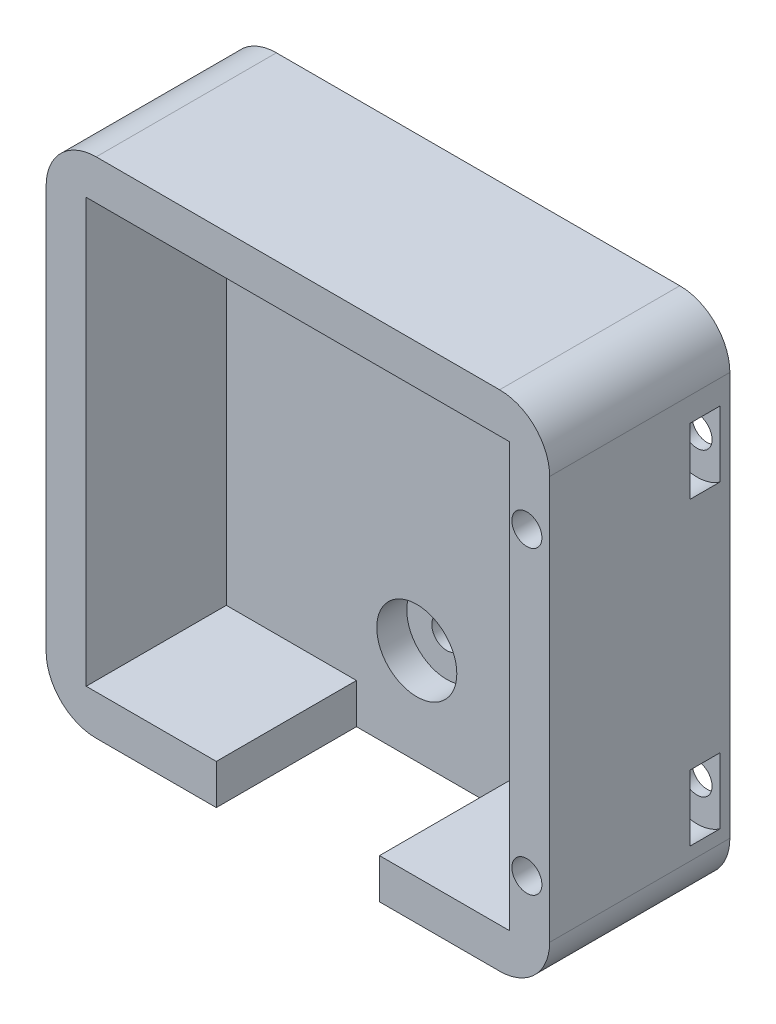
ISO-10303-21;
HEADER;
FILE_DESCRIPTION(('STEP AP214'),'2;1');
FILE_NAME('part.step','',(''),(''),'','','');
FILE_SCHEMA(('AUTOMOTIVE_DESIGN { 1 0 10303 214 1 1 1 1 }'));
ENDSEC;
DATA;
#1=APPLICATION_CONTEXT('core data for automotive mechanical design processes');
#2=APPLICATION_PROTOCOL_DEFINITION('international standard','automotive_design',2000,#1);
#3=PRODUCT_CONTEXT('',#1,'mechanical');
#4=PRODUCT('Part','Part','',(#3));
#5=PRODUCT_RELATED_PRODUCT_CATEGORY('part','',(#4));
#6=PRODUCT_DEFINITION_FORMATION('','',#4);
#7=PRODUCT_DEFINITION_CONTEXT('part definition',#1,'design');
#8=PRODUCT_DEFINITION('design','',#6,#7);
#9=PRODUCT_DEFINITION_SHAPE('','',#8);
#10=(LENGTH_UNIT() NAMED_UNIT(*) SI_UNIT(.MILLI.,.METRE.));
#11=(NAMED_UNIT(*) PLANE_ANGLE_UNIT() SI_UNIT($,.RADIAN.));
#12=(NAMED_UNIT(*) SI_UNIT($,.STERADIAN.) SOLID_ANGLE_UNIT());
#13=UNCERTAINTY_MEASURE_WITH_UNIT(LENGTH_MEASURE(1.E-05),#10,'distance_accuracy_value','');
#14=(GEOMETRIC_REPRESENTATION_CONTEXT(3) GLOBAL_UNCERTAINTY_ASSIGNED_CONTEXT((#13)) GLOBAL_UNIT_ASSIGNED_CONTEXT((#10,
#11,#12)) REPRESENTATION_CONTEXT('',''));
#15=CARTESIAN_POINT('',(0.,0.,0.));
#16=DIRECTION('',(0.,0.,1.));
#17=DIRECTION('',(1.,0.,0.));
#18=AXIS2_PLACEMENT_3D('',#15,#16,#17);
#19=CARTESIAN_POINT('',(50.3,0.,4.));
#20=DIRECTION('',(-1.,0.,0.));
#21=DIRECTION('',(0.,0.,1.));
#22=AXIS2_PLACEMENT_3D('',#19,#20,#21);
#23=PLANE('',#22);
#24=DIRECTION('',(0.,1.,0.));
#25=VECTOR('',#24,1.);
#26=CARTESIAN_POINT('',(50.3,0.,1.));
#27=LINE('',#26,#25);
#28=CARTESIAN_POINT('',(50.3,6.31049959872425,1.));
#29=VERTEX_POINT('',#28);
#30=CARTESIAN_POINT('',(50.3,12.8895004012762,1.));
#31=VERTEX_POINT('',#30);
#32=EDGE_CURVE('E288',#29,#31,#27,.T.);
#33=ORIENTED_EDGE('',*,*,#32,.F.);
#34=DIRECTION('',(0.,0.,1.));
#35=VECTOR('',#34,1.);
#36=CARTESIAN_POINT('',(50.3,6.31049959872425,1.));
#37=LINE('',#36,#35);
#38=CARTESIAN_POINT('',(50.3,6.31049959872425,4.));
#39=VERTEX_POINT('',#38);
#40=EDGE_CURVE('E339',#29,#39,#37,.T.);
#41=ORIENTED_EDGE('',*,*,#40,.T.);
#42=DIRECTION('',(0.,1.,0.));
#43=VECTOR('',#42,1.);
#44=CARTESIAN_POINT('',(50.3,0.,4.));
#45=LINE('',#44,#43);
#46=CARTESIAN_POINT('',(50.3,12.8895004012762,4.));
#47=VERTEX_POINT('',#46);
#48=EDGE_CURVE('E293',#39,#47,#45,.T.);
#49=ORIENTED_EDGE('',*,*,#48,.T.);
#50=DIRECTION('',(0.,0.,1.));
#51=VECTOR('',#50,1.);
#52=CARTESIAN_POINT('',(50.3,12.8895004012762,1.));
#53=LINE('',#52,#51);
#54=EDGE_CURVE('E336',#47,#31,#53,.F.);
#55=ORIENTED_EDGE('',*,*,#54,.T.);
#56=EDGE_LOOP('',(#33,#41,#49,#55));
#57=FACE_BOUND('',#56,.T.);
#58=DIRECTION('',(0.,1.,0.));
#59=VECTOR('',#58,1.);
#60=CARTESIAN_POINT('',(50.3,0.,0.));
#61=LINE('',#60,#59);
#62=CARTESIAN_POINT('',(50.3,5.,0.));
#63=VERTEX_POINT('',#62);
#64=CARTESIAN_POINT('',(50.3,45.3,0.));
#65=VERTEX_POINT('',#64);
#66=EDGE_CURVE('E379',#63,#65,#61,.T.);
#67=ORIENTED_EDGE('',*,*,#66,.T.);
#68=DIRECTION('',(0.,0.,-1.));
#69=VECTOR('',#68,1.);
#70=CARTESIAN_POINT('',(50.3,45.3,4.));
#71=LINE('',#70,#69);
#72=CARTESIAN_POINT('',(50.3,45.3,18.));
#73=VERTEX_POINT('',#72);
#74=EDGE_CURVE('E359',#65,#73,#71,.F.);
#75=ORIENTED_EDGE('',*,*,#74,.T.);
#76=DIRECTION('',(0.,1.,0.));
#77=VECTOR('',#76,1.);
#78=CARTESIAN_POINT('',(50.3,50.3,18.));
#79=LINE('',#78,#77);
#80=CARTESIAN_POINT('',(50.3,5.00000000000001,18.));
#81=VERTEX_POINT('',#80);
#82=EDGE_CURVE('E249',#81,#73,#79,.T.);
#83=ORIENTED_EDGE('',*,*,#82,.F.);
#84=DIRECTION('',(0.,0.,-1.));
#85=VECTOR('',#84,1.);
#86=CARTESIAN_POINT('',(50.3,5.,4.));
#87=LINE('',#86,#85);
#88=EDGE_CURVE('E356',#81,#63,#87,.T.);
#89=ORIENTED_EDGE('',*,*,#88,.T.);
#90=EDGE_LOOP('',(#67,#75,#83,#89));
#91=FACE_BOUND('',#90,.T.);
#92=DIRECTION('',(0.,1.,0.));
#93=VECTOR('',#92,1.);
#94=CARTESIAN_POINT('',(50.3,0.,1.));
#95=LINE('',#94,#93);
#96=CARTESIAN_POINT('',(50.3,36.3104995987245,1.));
#97=VERTEX_POINT('',#96);
#98=CARTESIAN_POINT('',(50.3,42.8895004012759,1.));
#99=VERTEX_POINT('',#98);
#100=EDGE_CURVE('E299',#97,#99,#95,.T.);
#101=ORIENTED_EDGE('',*,*,#100,.F.);
#102=DIRECTION('',(0.,0.,1.));
#103=VECTOR('',#102,1.);
#104=CARTESIAN_POINT('',(50.3,36.3104995987245,1.));
#105=LINE('',#104,#103);
#106=CARTESIAN_POINT('',(50.3,36.3104995987245,4.));
#107=VERTEX_POINT('',#106);
#108=EDGE_CURVE('E344',#97,#107,#105,.T.);
#109=ORIENTED_EDGE('',*,*,#108,.T.);
#110=DIRECTION('',(0.,1.,0.));
#111=VECTOR('',#110,1.);
#112=CARTESIAN_POINT('',(50.3,0.,4.));
#113=LINE('',#112,#111);
#114=CARTESIAN_POINT('',(50.3,42.8895004012759,4.));
#115=VERTEX_POINT('',#114);
#116=EDGE_CURVE('E195',#107,#115,#113,.T.);
#117=ORIENTED_EDGE('',*,*,#116,.T.);
#118=DIRECTION('',(0.,0.,1.));
#119=VECTOR('',#118,1.);
#120=CARTESIAN_POINT('',(50.3,42.8895004012759,1.));
#121=LINE('',#120,#119);
#122=EDGE_CURVE('E204',#115,#99,#121,.F.);
#123=ORIENTED_EDGE('',*,*,#122,.T.);
#124=EDGE_LOOP('',(#101,#109,#117,#123));
#125=FACE_BOUND('',#124,.T.);
#126=ADVANCED_FACE('F33',(#57,#91,#125),#23,.F.);
#127=CARTESIAN_POINT('',(48.0242172533378,9.60000000000021,18.));
#128=DIRECTION('',(0.,0.,-1.));
#129=DIRECTION('',(-1.,0.,0.));
#130=AXIS2_PLACEMENT_3D('',#127,#128,#129);
#131=CYLINDRICAL_SURFACE('',#130,1.5);
#132=CARTESIAN_POINT('',(48.0242172533378,9.60000000000021,0.));
#133=DIRECTION('',(0.,0.,-1.));
#134=DIRECTION('',(-1.,0.,0.));
#135=AXIS2_PLACEMENT_3D('',#132,#133,#134);
#136=CIRCLE('',#135,1.5);
#137=CARTESIAN_POINT('',(46.5242172533378,9.60000000000021,0.));
#138=VERTEX_POINT('',#137);
#139=EDGE_CURVE('E272',#138,#138,#136,.T.);
#140=ORIENTED_EDGE('',*,*,#139,.T.);
#141=EDGE_LOOP('',(#140));
#142=FACE_BOUND('',#141,.T.);
#143=CARTESIAN_POINT('',(48.0242172533378,9.60000000000021,1.));
#144=DIRECTION('',(0.,0.,1.));
#145=DIRECTION('',(1.,0.,0.));
#146=AXIS2_PLACEMENT_3D('',#143,#144,#145);
#147=CIRCLE('',#146,1.5);
#148=CARTESIAN_POINT('',(49.5242172533378,9.60000000000021,1.));
#149=VERTEX_POINT('',#148);
#150=EDGE_CURVE('E292',#149,#149,#147,.F.);
#151=ORIENTED_EDGE('',*,*,#150,.F.);
#152=EDGE_LOOP('',(#151));
#153=FACE_BOUND('',#152,.T.);
#154=ADVANCED_FACE('F422',(#142,#153),#131,.F.);
#155=CARTESIAN_POINT('',(48.0242172533375,39.6000000000002,18.));
#156=DIRECTION('',(0.,0.,-1.));
#157=DIRECTION('',(-1.,0.,0.));
#158=AXIS2_PLACEMENT_3D('',#155,#156,#157);
#159=CYLINDRICAL_SURFACE('',#158,1.5);
#160=CARTESIAN_POINT('',(48.0242172533375,39.6000000000002,0.));
#161=DIRECTION('',(0.,0.,-1.));
#162=DIRECTION('',(-1.,0.,0.));
#163=AXIS2_PLACEMENT_3D('',#160,#161,#162);
#164=CIRCLE('',#163,1.5);
#165=CARTESIAN_POINT('',(46.5242172533375,39.6000000000002,0.));
#166=VERTEX_POINT('',#165);
#167=EDGE_CURVE('E279',#166,#166,#164,.T.);
#168=ORIENTED_EDGE('',*,*,#167,.T.);
#169=EDGE_LOOP('',(#168));
#170=FACE_BOUND('',#169,.T.);
#171=CARTESIAN_POINT('',(48.0242172533375,39.6000000000002,1.));
#172=DIRECTION('',(0.,0.,1.));
#173=DIRECTION('',(1.,0.,0.));
#174=AXIS2_PLACEMENT_3D('',#171,#172,#173);
#175=CIRCLE('',#174,1.5);
#176=CARTESIAN_POINT('',(49.5242172533375,39.6000000000002,1.));
#177=VERTEX_POINT('',#176);
#178=EDGE_CURVE('E301',#177,#177,#175,.F.);
#179=ORIENTED_EDGE('',*,*,#178,.F.);
#180=EDGE_LOOP('',(#179));
#181=FACE_BOUND('',#180,.T.);
#182=ADVANCED_FACE('F430',(#170,#181),#159,.F.);
#183=CARTESIAN_POINT('',(23.0242172533378,9.60000000000021,18.));
#184=DIRECTION('',(0.,0.,-1.));
#185=DIRECTION('',(-1.,0.,0.));
#186=AXIS2_PLACEMENT_3D('',#183,#184,#185);
#187=CYLINDRICAL_SURFACE('',#186,1.5);
#188=CARTESIAN_POINT('',(23.0242172533378,9.60000000000021,0.));
#189=DIRECTION('',(0.,0.,-1.));
#190=DIRECTION('',(-1.,0.,0.));
#191=AXIS2_PLACEMENT_3D('',#188,#189,#190);
#192=CIRCLE('',#191,1.5);
#193=CARTESIAN_POINT('',(21.5242172533378,9.60000000000021,0.));
#194=VERTEX_POINT('',#193);
#195=EDGE_CURVE('E269',#194,#194,#192,.T.);
#196=ORIENTED_EDGE('',*,*,#195,.T.);
#197=EDGE_LOOP('',(#196));
#198=FACE_BOUND('',#197,.T.);
#199=CARTESIAN_POINT('',(23.0242172533378,9.60000000000021,1.));
#200=DIRECTION('',(0.,0.,1.));
#201=DIRECTION('',(1.,0.,0.));
#202=AXIS2_PLACEMENT_3D('',#199,#200,#201);
#203=CIRCLE('',#202,1.5);
#204=CARTESIAN_POINT('',(24.5242172533378,9.60000000000021,1.));
#205=VERTEX_POINT('',#204);
#206=EDGE_CURVE('E318',#205,#205,#203,.F.);
#207=ORIENTED_EDGE('',*,*,#206,.F.);
#208=EDGE_LOOP('',(#207));
#209=FACE_BOUND('',#208,.T.);
#210=ADVANCED_FACE('F462',(#198,#209),#187,.F.);
#211=CARTESIAN_POINT('',(23.0242172533375,39.6000000000002,18.));
#212=DIRECTION('',(0.,0.,-1.));
#213=DIRECTION('',(-1.,0.,0.));
#214=AXIS2_PLACEMENT_3D('',#211,#212,#213);
#215=CYLINDRICAL_SURFACE('',#214,1.5);
#216=CARTESIAN_POINT('',(23.0242172533375,39.6000000000002,0.));
#217=DIRECTION('',(0.,0.,-1.));
#218=DIRECTION('',(-1.,0.,0.));
#219=AXIS2_PLACEMENT_3D('',#216,#217,#218);
#220=CIRCLE('',#219,1.5);
#221=CARTESIAN_POINT('',(21.5242172533375,39.6000000000002,0.));
#222=VERTEX_POINT('',#221);
#223=EDGE_CURVE('E235',#222,#222,#220,.T.);
#224=ORIENTED_EDGE('',*,*,#223,.T.);
#225=EDGE_LOOP('',(#224));
#226=FACE_BOUND('',#225,.T.);
#227=CARTESIAN_POINT('',(23.0242172533375,39.6000000000002,1.));
#228=DIRECTION('',(0.,0.,1.));
#229=DIRECTION('',(1.,0.,0.));
#230=AXIS2_PLACEMENT_3D('',#227,#228,#229);
#231=CIRCLE('',#230,1.5);
#232=CARTESIAN_POINT('',(24.5242172533375,39.6000000000002,1.));
#233=VERTEX_POINT('',#232);
#234=EDGE_CURVE('E273',#233,#233,#231,.F.);
#235=ORIENTED_EDGE('',*,*,#234,.F.);
#236=EDGE_LOOP('',(#235));
#237=FACE_BOUND('',#236,.T.);
#238=ADVANCED_FACE('F467',(#226,#237),#215,.F.);
#239=CARTESIAN_POINT('',(0.,0.,4.));
#240=DIRECTION('',(0.,0.,-1.));
#241=DIRECTION('',(-1.,0.,0.));
#242=AXIS2_PLACEMENT_3D('',#239,#240,#241);
#243=PLANE('',#242);
#244=CARTESIAN_POINT('',(23.0242172533378,9.60000000000021,4.));
#245=DIRECTION('',(0.,0.,1.));
#246=DIRECTION('',(1.,0.,0.));
#247=AXIS2_PLACEMENT_3D('',#244,#245,#246);
#248=CIRCLE('',#247,4.00000000000001);
#249=CARTESIAN_POINT('',(27.0242172533378,9.60000000000021,4.));
#250=VERTEX_POINT('',#249);
#251=EDGE_CURVE('E313',#250,#250,#248,.T.);
#252=ORIENTED_EDGE('',*,*,#251,.F.);
#253=EDGE_LOOP('',(#252));
#254=FACE_BOUND('',#253,.T.);
#255=CARTESIAN_POINT('',(23.0242172533375,39.6000000000002,4.));
#256=DIRECTION('',(0.,0.,1.));
#257=DIRECTION('',(1.,0.,0.));
#258=AXIS2_PLACEMENT_3D('',#255,#256,#257);
#259=CIRCLE('',#258,4.);
#260=CARTESIAN_POINT('',(27.0242172533375,39.6000000000002,4.));
#261=VERTEX_POINT('',#260);
#262=EDGE_CURVE('E284',#261,#261,#259,.T.);
#263=ORIENTED_EDGE('',*,*,#262,.F.);
#264=EDGE_LOOP('',(#263));
#265=FACE_BOUND('',#264,.T.);
#266=DIRECTION('',(0.,-1.,0.));
#267=VECTOR('',#266,1.);
#268=CARTESIAN_POINT('',(46.3,46.3,4.));
#269=LINE('',#268,#267);
#270=CARTESIAN_POINT('',(46.3,35.9906960694212,4.));
#271=VERTEX_POINT('',#270);
#272=CARTESIAN_POINT('',(46.3,13.2093039305791,4.));
#273=VERTEX_POINT('',#272);
#274=EDGE_CURVE('E213',#271,#273,#269,.T.);
#275=ORIENTED_EDGE('',*,*,#274,.F.);
#276=CARTESIAN_POINT('',(48.0242172533375,39.6000000000002,4.));
#277=DIRECTION('',(0.,0.,1.));
#278=DIRECTION('',(1.,0.,0.));
#279=AXIS2_PLACEMENT_3D('',#276,#277,#278);
#280=CIRCLE('',#279,4.00000000000001);
#281=CARTESIAN_POINT('',(46.3,43.2093039305793,4.));
#282=VERTEX_POINT('',#281);
#283=EDGE_CURVE('E202',#282,#271,#280,.T.);
#284=ORIENTED_EDGE('',*,*,#283,.F.);
#285=CARTESIAN_POINT('',(46.3,46.3,4.));
#286=VERTEX_POINT('',#285);
#287=EDGE_CURVE('E210',#286,#282,#269,.T.);
#288=ORIENTED_EDGE('',*,*,#287,.F.);
#289=DIRECTION('',(1.,0.,0.));
#290=VECTOR('',#289,1.);
#291=CARTESIAN_POINT('',(4.,46.3,4.));
#292=LINE('',#291,#290);
#293=CARTESIAN_POINT('',(4.,46.3,4.));
#294=VERTEX_POINT('',#293);
#295=EDGE_CURVE('E226',#294,#286,#292,.T.);
#296=ORIENTED_EDGE('',*,*,#295,.F.);
#297=DIRECTION('',(0.,1.,0.));
#298=VECTOR('',#297,1.);
#299=CARTESIAN_POINT('',(4.,46.3,4.));
#300=LINE('',#299,#298);
#301=CARTESIAN_POINT('',(4.00000000000001,4.,4.));
#302=VERTEX_POINT('',#301);
#303=EDGE_CURVE('E231',#302,#294,#300,.T.);
#304=ORIENTED_EDGE('',*,*,#303,.F.);
#305=DIRECTION('',(-1.,0.,0.));
#306=VECTOR('',#305,1.);
#307=CARTESIAN_POINT('',(4.00000000000001,4.,4.));
#308=LINE('',#307,#306);
#309=CARTESIAN_POINT('',(17.,4.,4.));
#310=VERTEX_POINT('',#309);
#311=EDGE_CURVE('E265',#310,#302,#308,.T.);
#312=ORIENTED_EDGE('',*,*,#311,.F.);
#313=DIRECTION('',(0.,1.,0.));
#314=VECTOR('',#313,1.);
#315=CARTESIAN_POINT('',(17.,4.,4.));
#316=LINE('',#315,#314);
#317=CARTESIAN_POINT('',(17.,0.,4.));
#318=VERTEX_POINT('',#317);
#319=EDGE_CURVE('E571',#318,#310,#316,.T.);
#320=ORIENTED_EDGE('',*,*,#319,.F.);
#321=DIRECTION('',(1.,0.,0.));
#322=VECTOR('',#321,1.);
#323=CARTESIAN_POINT('',(0.,0.,4.));
#324=LINE('',#323,#322);
#325=CARTESIAN_POINT('',(33.3,0.,4.));
#326=VERTEX_POINT('',#325);
#327=EDGE_CURVE('E390',#318,#326,#324,.T.);
#328=ORIENTED_EDGE('',*,*,#327,.T.);
#329=DIRECTION('',(0.,-1.,0.));
#330=VECTOR('',#329,1.);
#331=CARTESIAN_POINT('',(33.3,4.00000000000001,4.));
#332=LINE('',#331,#330);
#333=CARTESIAN_POINT('',(33.3,4.00000000000001,4.));
#334=VERTEX_POINT('',#333);
#335=EDGE_CURVE('E223',#334,#326,#332,.T.);
#336=ORIENTED_EDGE('',*,*,#335,.F.);
#337=DIRECTION('',(-1.,0.,0.));
#338=VECTOR('',#337,1.);
#339=CARTESIAN_POINT('',(33.3,4.00000000000001,4.));
#340=LINE('',#339,#338);
#341=CARTESIAN_POINT('',(46.3,4.,4.));
#342=VERTEX_POINT('',#341);
#343=EDGE_CURVE('E219',#342,#334,#340,.T.);
#344=ORIENTED_EDGE('',*,*,#343,.F.);
#345=CARTESIAN_POINT('',(46.3,5.99069606942131,4.));
#346=VERTEX_POINT('',#345);
#347=EDGE_CURVE('E221',#346,#342,#269,.T.);
#348=ORIENTED_EDGE('',*,*,#347,.F.);
#349=CARTESIAN_POINT('',(48.0242172533378,9.60000000000021,4.));
#350=DIRECTION('',(0.,0.,1.));
#351=DIRECTION('',(1.,0.,0.));
#352=AXIS2_PLACEMENT_3D('',#349,#350,#351);
#353=CIRCLE('',#352,4.00000000000001);
#354=EDGE_CURVE('E307',#273,#346,#353,.T.);
#355=ORIENTED_EDGE('',*,*,#354,.F.);
#356=EDGE_LOOP('',(#275,#284,#288,#296,#304,#312,#320,#328,#336,#344,#348,#355));
#357=FACE_BOUND('',#356,.T.);
#358=ADVANCED_FACE('F209',(#254,#265,#357),#243,.F.);
#359=CARTESIAN_POINT('',(0.,0.,4.));
#360=DIRECTION('',(1.,0.,0.));
#361=DIRECTION('',(0.,0.,-1.));
#362=AXIS2_PLACEMENT_3D('',#359,#360,#361);
#363=PLANE('',#362);
#364=DIRECTION('',(0.,-1.,0.));
#365=VECTOR('',#364,1.);
#366=CARTESIAN_POINT('',(0.,0.,0.));
#367=LINE('',#366,#365);
#368=CARTESIAN_POINT('',(0.,45.3,0.));
#369=VERTEX_POINT('',#368);
#370=CARTESIAN_POINT('',(0.,5.,0.));
#371=VERTEX_POINT('',#370);
#372=EDGE_CURVE('E380',#369,#371,#367,.T.);
#373=ORIENTED_EDGE('',*,*,#372,.T.);
#374=DIRECTION('',(0.,0.,-1.));
#375=VECTOR('',#374,1.);
#376=CARTESIAN_POINT('',(0.,5.,4.));
#377=LINE('',#376,#375);
#378=CARTESIAN_POINT('',(0.,5.00000000000001,18.));
#379=VERTEX_POINT('',#378);
#380=EDGE_CURVE('E11',#371,#379,#377,.F.);
#381=ORIENTED_EDGE('',*,*,#380,.T.);
#382=DIRECTION('',(0.,-1.,0.));
#383=VECTOR('',#382,1.);
#384=CARTESIAN_POINT('',(0.,50.3,18.));
#385=LINE('',#384,#383);
#386=CARTESIAN_POINT('',(0.,45.3,18.));
#387=VERTEX_POINT('',#386);
#388=EDGE_CURVE('E245',#387,#379,#385,.T.);
#389=ORIENTED_EDGE('',*,*,#388,.F.);
#390=DIRECTION('',(0.,0.,-1.));
#391=VECTOR('',#390,1.);
#392=CARTESIAN_POINT('',(0.,45.3,4.));
#393=LINE('',#392,#391);
#394=EDGE_CURVE('E391',#387,#369,#393,.T.);
#395=ORIENTED_EDGE('',*,*,#394,.T.);
#396=EDGE_LOOP('',(#373,#381,#389,#395));
#397=FACE_BOUND('',#396,.T.);
#398=ADVANCED_FACE('F407',(#397),#363,.F.);
#399=CARTESIAN_POINT('',(0.,0.,4.));
#400=DIRECTION('',(0.,1.,0.));
#401=DIRECTION('',(0.,0.,1.));
#402=AXIS2_PLACEMENT_3D('',#399,#400,#401);
#403=PLANE('',#402);
#404=DIRECTION('',(1.,0.,0.));
#405=VECTOR('',#404,1.);
#406=CARTESIAN_POINT('',(0.,0.,18.));
#407=LINE('',#406,#405);
#408=CARTESIAN_POINT('',(5.,0.,18.));
#409=VERTEX_POINT('',#408);
#410=CARTESIAN_POINT('',(17.,0.,18.));
#411=VERTEX_POINT('',#410);
#412=EDGE_CURVE('E243',#409,#411,#407,.T.);
#413=ORIENTED_EDGE('',*,*,#412,.F.);
#414=DIRECTION('',(0.,0.,-1.));
#415=VECTOR('',#414,1.);
#416=CARTESIAN_POINT('',(5.,0.,4.));
#417=LINE('',#416,#415);
#418=CARTESIAN_POINT('',(5.,0.,0.));
#419=VERTEX_POINT('',#418);
#420=EDGE_CURVE('E41',#409,#419,#417,.T.);
#421=ORIENTED_EDGE('',*,*,#420,.T.);
#422=DIRECTION('',(1.,0.,0.));
#423=VECTOR('',#422,1.);
#424=CARTESIAN_POINT('',(0.,0.,0.));
#425=LINE('',#424,#423);
#426=CARTESIAN_POINT('',(45.3,0.,0.));
#427=VERTEX_POINT('',#426);
#428=EDGE_CURVE('E370',#419,#427,#425,.T.);
#429=ORIENTED_EDGE('',*,*,#428,.T.);
#430=DIRECTION('',(0.,0.,-1.));
#431=VECTOR('',#430,1.);
#432=CARTESIAN_POINT('',(45.3,0.,4.));
#433=LINE('',#432,#431);
#434=CARTESIAN_POINT('',(45.3,0.,18.));
#435=VERTEX_POINT('',#434);
#436=EDGE_CURVE('E48',#427,#435,#433,.F.);
#437=ORIENTED_EDGE('',*,*,#436,.T.);
#438=DIRECTION('',(1.,0.,0.));
#439=VECTOR('',#438,1.);
#440=CARTESIAN_POINT('',(33.3,0.,18.));
#441=LINE('',#440,#439);
#442=CARTESIAN_POINT('',(33.3,0.,18.));
#443=VERTEX_POINT('',#442);
#444=EDGE_CURVE('E252',#443,#435,#441,.T.);
#445=ORIENTED_EDGE('',*,*,#444,.F.);
#446=DIRECTION('',(0.,0.,-1.));
#447=VECTOR('',#446,1.);
#448=CARTESIAN_POINT('',(33.3,0.,18.));
#449=LINE('',#448,#447);
#450=EDGE_CURVE('E565',#443,#326,#449,.T.);
#451=ORIENTED_EDGE('',*,*,#450,.T.);
#452=ORIENTED_EDGE('',*,*,#327,.F.);
#453=DIRECTION('',(0.,0.,-1.));
#454=VECTOR('',#453,1.);
#455=CARTESIAN_POINT('',(17.,0.,18.));
#456=LINE('',#455,#454);
#457=EDGE_CURVE('E579',#411,#318,#456,.T.);
#458=ORIENTED_EDGE('',*,*,#457,.F.);
#459=EDGE_LOOP('',(#413,#421,#429,#437,#445,#451,#452,#458));
#460=FACE_BOUND('',#459,.T.);
#461=ADVANCED_FACE('F369',(#460),#403,.F.);
#462=CARTESIAN_POINT('',(0.,50.3,4.));
#463=DIRECTION('',(0.,-1.,0.));
#464=DIRECTION('',(0.,0.,-1.));
#465=AXIS2_PLACEMENT_3D('',#462,#463,#464);
#466=PLANE('',#465);
#467=DIRECTION('',(-1.,0.,0.));
#468=VECTOR('',#467,1.);
#469=CARTESIAN_POINT('',(0.,50.3,18.));
#470=LINE('',#469,#468);
#471=CARTESIAN_POINT('',(45.3,50.3,18.));
#472=VERTEX_POINT('',#471);
#473=CARTESIAN_POINT('',(5.,50.3,18.));
#474=VERTEX_POINT('',#473);
#475=EDGE_CURVE('E247',#472,#474,#470,.T.);
#476=ORIENTED_EDGE('',*,*,#475,.F.);
#477=DIRECTION('',(0.,0.,-1.));
#478=VECTOR('',#477,1.);
#479=CARTESIAN_POINT('',(45.3,50.3,4.));
#480=LINE('',#479,#478);
#481=CARTESIAN_POINT('',(45.3,50.3,0.));
#482=VERTEX_POINT('',#481);
#483=EDGE_CURVE('E347',#472,#482,#480,.T.);
#484=ORIENTED_EDGE('',*,*,#483,.T.);
#485=DIRECTION('',(-1.,0.,0.));
#486=VECTOR('',#485,1.);
#487=CARTESIAN_POINT('',(0.,50.3,0.));
#488=LINE('',#487,#486);
#489=CARTESIAN_POINT('',(5.,50.3,0.));
#490=VERTEX_POINT('',#489);
#491=EDGE_CURVE('E383',#482,#490,#488,.T.);
#492=ORIENTED_EDGE('',*,*,#491,.T.);
#493=DIRECTION('',(0.,0.,-1.));
#494=VECTOR('',#493,1.);
#495=CARTESIAN_POINT('',(5.,50.3,4.));
#496=LINE('',#495,#494);
#497=EDGE_CURVE('E397',#490,#474,#496,.F.);
#498=ORIENTED_EDGE('',*,*,#497,.T.);
#499=EDGE_LOOP('',(#476,#484,#492,#498));
#500=FACE_BOUND('',#499,.T.);
#501=ADVANCED_FACE('F438',(#500),#466,.F.);
#502=CARTESIAN_POINT('',(0.,0.,0.));
#503=DIRECTION('',(0.,0.,-1.));
#504=DIRECTION('',(-1.,0.,0.));
#505=AXIS2_PLACEMENT_3D('',#502,#503,#504);
#506=PLANE('',#505);
#507=ORIENTED_EDGE('',*,*,#167,.F.);
#508=EDGE_LOOP('',(#507));
#509=FACE_BOUND('',#508,.T.);
#510=ORIENTED_EDGE('',*,*,#139,.F.);
#511=EDGE_LOOP('',(#510));
#512=FACE_BOUND('',#511,.T.);
#513=ORIENTED_EDGE('',*,*,#195,.F.);
#514=EDGE_LOOP('',(#513));
#515=FACE_BOUND('',#514,.T.);
#516=ORIENTED_EDGE('',*,*,#223,.F.);
#517=EDGE_LOOP('',(#516));
#518=FACE_BOUND('',#517,.T.);
#519=ORIENTED_EDGE('',*,*,#491,.F.);
#520=CARTESIAN_POINT('',(45.3,45.3,0.));
#521=DIRECTION('',(0.,0.,-1.));
#522=DIRECTION('',(-1.,0.,0.));
#523=AXIS2_PLACEMENT_3D('',#520,#521,#522);
#524=CIRCLE('',#523,5.);
#525=EDGE_CURVE('E354',#482,#65,#524,.T.);
#526=ORIENTED_EDGE('',*,*,#525,.T.);
#527=ORIENTED_EDGE('',*,*,#66,.F.);
#528=CARTESIAN_POINT('',(45.3,5.,0.));
#529=DIRECTION('',(0.,0.,-1.));
#530=DIRECTION('',(-1.,0.,0.));
#531=AXIS2_PLACEMENT_3D('',#528,#529,#530);
#532=CIRCLE('',#531,5.);
#533=EDGE_CURVE('E350',#63,#427,#532,.T.);
#534=ORIENTED_EDGE('',*,*,#533,.T.);
#535=ORIENTED_EDGE('',*,*,#428,.F.);
#536=CARTESIAN_POINT('',(5.,5.,0.));
#537=DIRECTION('',(0.,0.,-1.));
#538=DIRECTION('',(-1.,0.,0.));
#539=AXIS2_PLACEMENT_3D('',#536,#537,#538);
#540=CIRCLE('',#539,5.);
#541=EDGE_CURVE('E352',#419,#371,#540,.T.);
#542=ORIENTED_EDGE('',*,*,#541,.T.);
#543=ORIENTED_EDGE('',*,*,#372,.F.);
#544=CARTESIAN_POINT('',(5.,45.3,0.));
#545=DIRECTION('',(0.,0.,-1.));
#546=DIRECTION('',(-1.,0.,0.));
#547=AXIS2_PLACEMENT_3D('',#544,#545,#546);
#548=CIRCLE('',#547,5.);
#549=EDGE_CURVE('E394',#369,#490,#548,.T.);
#550=ORIENTED_EDGE('',*,*,#549,.T.);
#551=EDGE_LOOP('',(#519,#526,#527,#534,#535,#542,#543,#550));
#552=FACE_BOUND('',#551,.T.);
#553=ADVANCED_FACE('F375',(#509,#512,#515,#518,#552),#506,.T.);
#554=CARTESIAN_POINT('',(4.,46.3,18.));
#555=DIRECTION('',(-1.,0.,0.));
#556=DIRECTION('',(0.,-1.,0.));
#557=AXIS2_PLACEMENT_3D('',#554,#555,#556);
#558=PLANE('',#557);
#559=ORIENTED_EDGE('',*,*,#303,.T.);
#560=DIRECTION('',(0.,0.,-1.));
#561=VECTOR('',#560,1.);
#562=CARTESIAN_POINT('',(4.,46.3,18.));
#563=LINE('',#562,#561);
#564=CARTESIAN_POINT('',(4.,46.3,18.));
#565=VERTEX_POINT('',#564);
#566=EDGE_CURVE('E385',#565,#294,#563,.T.);
#567=ORIENTED_EDGE('',*,*,#566,.F.);
#568=DIRECTION('',(0.,1.,0.));
#569=VECTOR('',#568,1.);
#570=CARTESIAN_POINT('',(4.,46.3,18.));
#571=LINE('',#570,#569);
#572=CARTESIAN_POINT('',(4.00000000000001,4.,18.));
#573=VERTEX_POINT('',#572);
#574=EDGE_CURVE('E262',#573,#565,#571,.T.);
#575=ORIENTED_EDGE('',*,*,#574,.F.);
#576=DIRECTION('',(0.,0.,-1.));
#577=VECTOR('',#576,1.);
#578=CARTESIAN_POINT('',(4.00000000000001,4.,18.));
#579=LINE('',#578,#577);
#580=EDGE_CURVE('E240',#573,#302,#579,.T.);
#581=ORIENTED_EDGE('',*,*,#580,.T.);
#582=EDGE_LOOP('',(#559,#567,#575,#581));
#583=FACE_BOUND('',#582,.T.);
#584=ADVANCED_FACE('F523',(#583),#558,.F.);
#585=CARTESIAN_POINT('',(4.,46.3,18.));
#586=DIRECTION('',(0.,1.,0.));
#587=DIRECTION('',(0.,0.,1.));
#588=AXIS2_PLACEMENT_3D('',#585,#586,#587);
#589=PLANE('',#588);
#590=ORIENTED_EDGE('',*,*,#295,.T.);
#591=DIRECTION('',(0.,0.,-1.));
#592=VECTOR('',#591,1.);
#593=CARTESIAN_POINT('',(46.3,46.3,18.));
#594=LINE('',#593,#592);
#595=CARTESIAN_POINT('',(46.3,46.3,18.));
#596=VERTEX_POINT('',#595);
#597=EDGE_CURVE('E218',#596,#286,#594,.T.);
#598=ORIENTED_EDGE('',*,*,#597,.F.);
#599=DIRECTION('',(1.,0.,0.));
#600=VECTOR('',#599,1.);
#601=CARTESIAN_POINT('',(4.,46.3,18.));
#602=LINE('',#601,#600);
#603=EDGE_CURVE('E260',#565,#596,#602,.T.);
#604=ORIENTED_EDGE('',*,*,#603,.F.);
#605=ORIENTED_EDGE('',*,*,#566,.T.);
#606=EDGE_LOOP('',(#590,#598,#604,#605));
#607=FACE_BOUND('',#606,.T.);
#608=ADVANCED_FACE('F532',(#607),#589,.F.);
#609=CARTESIAN_POINT('',(46.3,46.3,18.));
#610=DIRECTION('',(1.,0.,0.));
#611=DIRECTION('',(0.,1.,0.));
#612=AXIS2_PLACEMENT_3D('',#609,#610,#611);
#613=PLANE('',#612);
#614=ORIENTED_EDGE('',*,*,#287,.T.);
#615=DIRECTION('',(0.,-1.,0.));
#616=VECTOR('',#615,1.);
#617=CARTESIAN_POINT('',(46.3,46.3,4.));
#618=LINE('',#617,#616);
#619=EDGE_CURVE('E184',#282,#271,#618,.T.);
#620=ORIENTED_EDGE('',*,*,#619,.T.);
#621=ORIENTED_EDGE('',*,*,#274,.T.);
#622=DIRECTION('',(0.,-1.,0.));
#623=VECTOR('',#622,1.);
#624=CARTESIAN_POINT('',(46.3,46.3,4.));
#625=LINE('',#624,#623);
#626=EDGE_CURVE('E296',#273,#346,#625,.T.);
#627=ORIENTED_EDGE('',*,*,#626,.T.);
#628=ORIENTED_EDGE('',*,*,#347,.T.);
#629=DIRECTION('',(0.,0.,-1.));
#630=VECTOR('',#629,1.);
#631=CARTESIAN_POINT('',(46.3,4.,18.));
#632=LINE('',#631,#630);
#633=CARTESIAN_POINT('',(46.3,4.,18.));
#634=VERTEX_POINT('',#633);
#635=EDGE_CURVE('E560',#634,#342,#632,.T.);
#636=ORIENTED_EDGE('',*,*,#635,.F.);
#637=DIRECTION('',(0.,-1.,0.));
#638=VECTOR('',#637,1.);
#639=CARTESIAN_POINT('',(46.3,46.3,18.));
#640=LINE('',#639,#638);
#641=EDGE_CURVE('E258',#596,#634,#640,.T.);
#642=ORIENTED_EDGE('',*,*,#641,.F.);
#643=ORIENTED_EDGE('',*,*,#597,.T.);
#644=EDGE_LOOP('',(#614,#620,#621,#627,#628,#636,#642,#643));
#645=FACE_BOUND('',#644,.T.);
#646=ADVANCED_FACE('F215',(#645),#613,.F.);
#647=CARTESIAN_POINT('',(33.3,4.00000000000001,18.));
#648=DIRECTION('',(0.,-1.,0.));
#649=DIRECTION('',(1.,0.,0.));
#650=AXIS2_PLACEMENT_3D('',#647,#648,#649);
#651=PLANE('',#650);
#652=ORIENTED_EDGE('',*,*,#343,.T.);
#653=DIRECTION('',(0.,0.,-1.));
#654=VECTOR('',#653,1.);
#655=CARTESIAN_POINT('',(33.3,4.00000000000001,18.));
#656=LINE('',#655,#654);
#657=CARTESIAN_POINT('',(33.3,4.00000000000001,18.));
#658=VERTEX_POINT('',#657);
#659=EDGE_CURVE('E562',#658,#334,#656,.T.);
#660=ORIENTED_EDGE('',*,*,#659,.F.);
#661=DIRECTION('',(-1.,0.,0.));
#662=VECTOR('',#661,1.);
#663=CARTESIAN_POINT('',(33.3,4.00000000000001,18.));
#664=LINE('',#663,#662);
#665=EDGE_CURVE('E256',#634,#658,#664,.T.);
#666=ORIENTED_EDGE('',*,*,#665,.F.);
#667=ORIENTED_EDGE('',*,*,#635,.T.);
#668=EDGE_LOOP('',(#652,#660,#666,#667));
#669=FACE_BOUND('',#668,.T.);
#670=ADVANCED_FACE('F561',(#669),#651,.F.);
#671=CARTESIAN_POINT('',(33.3,4.00000000000001,18.));
#672=DIRECTION('',(1.,0.,0.));
#673=DIRECTION('',(0.,0.,-1.));
#674=AXIS2_PLACEMENT_3D('',#671,#672,#673);
#675=PLANE('',#674);
#676=ORIENTED_EDGE('',*,*,#335,.T.);
#677=ORIENTED_EDGE('',*,*,#450,.F.);
#678=DIRECTION('',(0.,-1.,0.));
#679=VECTOR('',#678,1.);
#680=CARTESIAN_POINT('',(33.3,4.00000000000001,18.));
#681=LINE('',#680,#679);
#682=EDGE_CURVE('E254',#658,#443,#681,.T.);
#683=ORIENTED_EDGE('',*,*,#682,.F.);
#684=ORIENTED_EDGE('',*,*,#659,.T.);
#685=EDGE_LOOP('',(#676,#677,#683,#684));
#686=FACE_BOUND('',#685,.T.);
#687=ADVANCED_FACE('F576',(#686),#675,.F.);
#688=CARTESIAN_POINT('',(17.,4.,18.));
#689=DIRECTION('',(-1.,0.,0.));
#690=DIRECTION('',(0.,0.,1.));
#691=AXIS2_PLACEMENT_3D('',#688,#689,#690);
#692=PLANE('',#691);
#693=ORIENTED_EDGE('',*,*,#319,.T.);
#694=DIRECTION('',(0.,0.,-1.));
#695=VECTOR('',#694,1.);
#696=CARTESIAN_POINT('',(17.,4.,18.));
#697=LINE('',#696,#695);
#698=CARTESIAN_POINT('',(17.,4.,18.));
#699=VERTEX_POINT('',#698);
#700=EDGE_CURVE('E580',#699,#310,#697,.T.);
#701=ORIENTED_EDGE('',*,*,#700,.F.);
#702=DIRECTION('',(0.,1.,0.));
#703=VECTOR('',#702,1.);
#704=CARTESIAN_POINT('',(17.,4.,18.));
#705=LINE('',#704,#703);
#706=EDGE_CURVE('E241',#411,#699,#705,.T.);
#707=ORIENTED_EDGE('',*,*,#706,.F.);
#708=ORIENTED_EDGE('',*,*,#457,.T.);
#709=EDGE_LOOP('',(#693,#701,#707,#708));
#710=FACE_BOUND('',#709,.T.);
#711=ADVANCED_FACE('F591',(#710),#692,.F.);
#712=CARTESIAN_POINT('',(4.00000000000001,4.,18.));
#713=DIRECTION('',(0.,-1.,0.));
#714=DIRECTION('',(1.,0.,0.));
#715=AXIS2_PLACEMENT_3D('',#712,#713,#714);
#716=PLANE('',#715);
#717=ORIENTED_EDGE('',*,*,#311,.T.);
#718=ORIENTED_EDGE('',*,*,#580,.F.);
#719=DIRECTION('',(-1.,0.,0.));
#720=VECTOR('',#719,1.);
#721=CARTESIAN_POINT('',(4.00000000000001,4.,18.));
#722=LINE('',#721,#720);
#723=EDGE_CURVE('E238',#699,#573,#722,.T.);
#724=ORIENTED_EDGE('',*,*,#723,.F.);
#725=ORIENTED_EDGE('',*,*,#700,.T.);
#726=EDGE_LOOP('',(#717,#718,#724,#725));
#727=FACE_BOUND('',#726,.T.);
#728=ADVANCED_FACE('F595',(#727),#716,.F.);
#729=CARTESIAN_POINT('',(0.,0.,18.));
#730=DIRECTION('',(0.,0.,1.));
#731=DIRECTION('',(1.,0.,0.));
#732=AXIS2_PLACEMENT_3D('',#729,#730,#731);
#733=PLANE('',#732);
#734=CARTESIAN_POINT('',(48.0242172533375,39.6000000000002,18.));
#735=DIRECTION('',(0.,0.,-1.));
#736=DIRECTION('',(-1.,0.,0.));
#737=AXIS2_PLACEMENT_3D('',#734,#735,#736);
#738=CIRCLE('',#737,1.5);
#739=CARTESIAN_POINT('',(46.5242172533375,39.6000000000002,18.));
#740=VERTEX_POINT('',#739);
#741=EDGE_CURVE('E268',#740,#740,#738,.T.);
#742=ORIENTED_EDGE('',*,*,#741,.T.);
#743=EDGE_LOOP('',(#742));
#744=FACE_BOUND('',#743,.T.);
#745=CARTESIAN_POINT('',(48.0242172533378,9.60000000000021,18.));
#746=DIRECTION('',(0.,0.,-1.));
#747=DIRECTION('',(-1.,0.,0.));
#748=AXIS2_PLACEMENT_3D('',#745,#746,#747);
#749=CIRCLE('',#748,1.5);
#750=CARTESIAN_POINT('',(46.5242172533378,9.60000000000021,18.));
#751=VERTEX_POINT('',#750);
#752=EDGE_CURVE('E276',#751,#751,#749,.T.);
#753=ORIENTED_EDGE('',*,*,#752,.T.);
#754=EDGE_LOOP('',(#753));
#755=FACE_BOUND('',#754,.T.);
#756=ORIENTED_EDGE('',*,*,#82,.T.);
#757=CARTESIAN_POINT('',(45.3,45.3,18.));
#758=DIRECTION('',(0.,0.,1.));
#759=DIRECTION('',(1.,0.,0.));
#760=AXIS2_PLACEMENT_3D('',#757,#758,#759);
#761=CIRCLE('',#760,5.);
#762=EDGE_CURVE('E364',#73,#472,#761,.T.);
#763=ORIENTED_EDGE('',*,*,#762,.T.);
#764=ORIENTED_EDGE('',*,*,#475,.T.);
#765=CARTESIAN_POINT('',(5.,45.3,18.));
#766=DIRECTION('',(0.,0.,1.));
#767=DIRECTION('',(1.,0.,0.));
#768=AXIS2_PLACEMENT_3D('',#765,#766,#767);
#769=CIRCLE('',#768,5.);
#770=EDGE_CURVE('E340',#474,#387,#769,.T.);
#771=ORIENTED_EDGE('',*,*,#770,.T.);
#772=ORIENTED_EDGE('',*,*,#388,.T.);
#773=CARTESIAN_POINT('',(5.,5.,18.));
#774=DIRECTION('',(0.,0.,1.));
#775=DIRECTION('',(1.,0.,0.));
#776=AXIS2_PLACEMENT_3D('',#773,#774,#775);
#777=CIRCLE('',#776,5.);
#778=EDGE_CURVE('E56',#379,#409,#777,.T.);
#779=ORIENTED_EDGE('',*,*,#778,.T.);
#780=ORIENTED_EDGE('',*,*,#412,.T.);
#781=ORIENTED_EDGE('',*,*,#706,.T.);
#782=ORIENTED_EDGE('',*,*,#723,.T.);
#783=ORIENTED_EDGE('',*,*,#574,.T.);
#784=ORIENTED_EDGE('',*,*,#603,.T.);
#785=ORIENTED_EDGE('',*,*,#641,.T.);
#786=ORIENTED_EDGE('',*,*,#665,.T.);
#787=ORIENTED_EDGE('',*,*,#682,.T.);
#788=ORIENTED_EDGE('',*,*,#444,.T.);
#789=CARTESIAN_POINT('',(45.3,5.,18.));
#790=DIRECTION('',(0.,0.,1.));
#791=DIRECTION('',(1.,0.,0.));
#792=AXIS2_PLACEMENT_3D('',#789,#790,#791);
#793=CIRCLE('',#792,5.);
#794=EDGE_CURVE('E361',#435,#81,#793,.T.);
#795=ORIENTED_EDGE('',*,*,#794,.T.);
#796=EDGE_LOOP('',(#756,#763,#764,#771,#772,#779,#780,#781,#782,#783,#784,#785,#786,#787,#788,#795));
#797=FACE_BOUND('',#796,.T.);
#798=ADVANCED_FACE('F401',(#744,#755,#797),#733,.T.);
#799=CARTESIAN_POINT('',(48.0242172533378,9.60000000000021,4.));
#800=DIRECTION('',(0.,0.,1.));
#801=DIRECTION('',(1.,0.,0.));
#802=AXIS2_PLACEMENT_3D('',#799,#800,#801);
#803=CIRCLE('',#802,1.5);
#804=CARTESIAN_POINT('',(49.5242172533378,9.60000000000021,4.));
#805=VERTEX_POINT('',#804);
#806=EDGE_CURVE('E298',#805,#805,#803,.F.);
#807=ORIENTED_EDGE('',*,*,#806,.T.);
#808=EDGE_LOOP('',(#807));
#809=FACE_BOUND('',#808,.T.);
#810=ORIENTED_EDGE('',*,*,#752,.F.);
#811=EDGE_LOOP('',(#810));
#812=FACE_BOUND('',#811,.T.);
#813=ADVANCED_FACE('F433',(#809,#812),#131,.F.);
#814=CARTESIAN_POINT('',(48.0242172533375,39.6000000000002,4.));
#815=DIRECTION('',(0.,0.,1.));
#816=DIRECTION('',(1.,0.,0.));
#817=AXIS2_PLACEMENT_3D('',#814,#815,#816);
#818=CIRCLE('',#817,1.5);
#819=CARTESIAN_POINT('',(49.5242172533375,39.6000000000002,4.));
#820=VERTEX_POINT('',#819);
#821=EDGE_CURVE('E196',#820,#820,#818,.F.);
#822=ORIENTED_EDGE('',*,*,#821,.T.);
#823=EDGE_LOOP('',(#822));
#824=FACE_BOUND('',#823,.T.);
#825=ORIENTED_EDGE('',*,*,#741,.F.);
#826=EDGE_LOOP('',(#825));
#827=FACE_BOUND('',#826,.T.);
#828=ADVANCED_FACE('F445',(#824,#827),#159,.F.);
#829=CARTESIAN_POINT('',(5.,45.3,4.));
#830=DIRECTION('',(0.,0.,-1.));
#831=DIRECTION('',(-1.,0.,0.));
#832=AXIS2_PLACEMENT_3D('',#829,#830,#831);
#833=CYLINDRICAL_SURFACE('',#832,5.);
#834=ORIENTED_EDGE('',*,*,#770,.F.);
#835=ORIENTED_EDGE('',*,*,#497,.F.);
#836=ORIENTED_EDGE('',*,*,#549,.F.);
#837=ORIENTED_EDGE('',*,*,#394,.F.);
#838=EDGE_LOOP('',(#834,#835,#836,#837));
#839=FACE_BOUND('',#838,.T.);
#840=ADVANCED_FACE('F409',(#839),#833,.T.);
#841=CARTESIAN_POINT('',(23.0242172533375,39.6000000000002,1.));
#842=DIRECTION('',(0.,0.,1.));
#843=DIRECTION('',(1.,0.,0.));
#844=AXIS2_PLACEMENT_3D('',#841,#842,#843);
#845=PLANE('',#844);
#846=CARTESIAN_POINT('',(23.0242172533375,39.6000000000002,1.));
#847=DIRECTION('',(0.,0.,1.));
#848=DIRECTION('',(1.,0.,0.));
#849=AXIS2_PLACEMENT_3D('',#846,#847,#848);
#850=CIRCLE('',#849,4.);
#851=CARTESIAN_POINT('',(27.0242172533375,39.6000000000002,1.));
#852=VERTEX_POINT('',#851);
#853=EDGE_CURVE('E287',#852,#852,#850,.T.);
#854=ORIENTED_EDGE('',*,*,#853,.T.);
#855=EDGE_LOOP('',(#854));
#856=FACE_BOUND('',#855,.T.);
#857=ORIENTED_EDGE('',*,*,#234,.T.);
#858=EDGE_LOOP('',(#857));
#859=FACE_BOUND('',#858,.T.);
#860=ADVANCED_FACE('F444',(#856,#859),#845,.T.);
#861=CARTESIAN_POINT('',(23.0242172533375,39.6000000000002,1.));
#862=DIRECTION('',(0.,0.,1.));
#863=DIRECTION('',(1.,0.,0.));
#864=AXIS2_PLACEMENT_3D('',#861,#862,#863);
#865=CYLINDRICAL_SURFACE('',#864,4.);
#866=ORIENTED_EDGE('',*,*,#853,.F.);
#867=EDGE_LOOP('',(#866));
#868=FACE_BOUND('',#867,.T.);
#869=ORIENTED_EDGE('',*,*,#262,.T.);
#870=EDGE_LOOP('',(#869));
#871=FACE_BOUND('',#870,.T.);
#872=ADVANCED_FACE('F450',(#868,#871),#865,.F.);
#873=CARTESIAN_POINT('',(23.0242172533378,9.60000000000021,1.));
#874=DIRECTION('',(0.,0.,1.));
#875=DIRECTION('',(1.,0.,0.));
#876=AXIS2_PLACEMENT_3D('',#873,#874,#875);
#877=PLANE('',#876);
#878=CARTESIAN_POINT('',(23.0242172533378,9.60000000000021,1.));
#879=DIRECTION('',(0.,0.,1.));
#880=DIRECTION('',(1.,0.,0.));
#881=AXIS2_PLACEMENT_3D('',#878,#879,#880);
#882=CIRCLE('',#881,4.00000000000001);
#883=CARTESIAN_POINT('',(27.0242172533378,9.60000000000021,1.));
#884=VERTEX_POINT('',#883);
#885=EDGE_CURVE('E316',#884,#884,#882,.T.);
#886=ORIENTED_EDGE('',*,*,#885,.T.);
#887=EDGE_LOOP('',(#886));
#888=FACE_BOUND('',#887,.T.);
#889=ORIENTED_EDGE('',*,*,#206,.T.);
#890=EDGE_LOOP('',(#889));
#891=FACE_BOUND('',#890,.T.);
#892=ADVANCED_FACE('F502',(#888,#891),#877,.T.);
#893=CARTESIAN_POINT('',(23.0242172533378,9.60000000000021,1.));
#894=DIRECTION('',(0.,0.,1.));
#895=DIRECTION('',(1.,0.,0.));
#896=AXIS2_PLACEMENT_3D('',#893,#894,#895);
#897=CYLINDRICAL_SURFACE('',#896,4.00000000000001);
#898=ORIENTED_EDGE('',*,*,#885,.F.);
#899=EDGE_LOOP('',(#898));
#900=FACE_BOUND('',#899,.T.);
#901=ORIENTED_EDGE('',*,*,#251,.T.);
#902=EDGE_LOOP('',(#901));
#903=FACE_BOUND('',#902,.T.);
#904=ADVANCED_FACE('F487',(#900,#903),#897,.F.);
#905=CARTESIAN_POINT('',(48.0242172533375,39.6000000000002,1.));
#906=DIRECTION('',(0.,0.,1.));
#907=DIRECTION('',(1.,0.,0.));
#908=AXIS2_PLACEMENT_3D('',#905,#906,#907);
#909=CYLINDRICAL_SURFACE('',#908,4.00000000000001);
#910=CARTESIAN_POINT('',(48.0242172533375,39.6000000000002,1.));
#911=DIRECTION('',(0.,0.,1.));
#912=DIRECTION('',(1.,0.,0.));
#913=AXIS2_PLACEMENT_3D('',#910,#911,#912);
#914=CIRCLE('',#913,4.00000000000001);
#915=EDGE_CURVE('E206',#99,#97,#914,.T.);
#916=ORIENTED_EDGE('',*,*,#915,.F.);
#917=ORIENTED_EDGE('',*,*,#122,.F.);
#918=EDGE_CURVE('E187',#115,#282,#280,.T.);
#919=ORIENTED_EDGE('',*,*,#918,.T.);
#920=ORIENTED_EDGE('',*,*,#283,.T.);
#921=EDGE_CURVE('E190',#271,#107,#280,.T.);
#922=ORIENTED_EDGE('',*,*,#921,.T.);
#923=ORIENTED_EDGE('',*,*,#108,.F.);
#924=EDGE_LOOP('',(#916,#917,#919,#920,#922,#923));
#925=FACE_BOUND('',#924,.T.);
#926=ADVANCED_FACE('F201',(#925),#909,.F.);
#927=CARTESIAN_POINT('',(48.0242172533375,39.6000000000002,1.));
#928=DIRECTION('',(0.,0.,1.));
#929=DIRECTION('',(1.,0.,0.));
#930=AXIS2_PLACEMENT_3D('',#927,#928,#929);
#931=PLANE('',#930);
#932=ORIENTED_EDGE('',*,*,#178,.T.);
#933=EDGE_LOOP('',(#932));
#934=FACE_BOUND('',#933,.T.);
#935=ORIENTED_EDGE('',*,*,#100,.T.);
#936=ORIENTED_EDGE('',*,*,#915,.T.);
#937=EDGE_LOOP('',(#935,#936));
#938=FACE_BOUND('',#937,.T.);
#939=ADVANCED_FACE('F474',(#934,#938),#931,.T.);
#940=CARTESIAN_POINT('',(48.0242172533375,39.6000000000002,4.));
#941=DIRECTION('',(0.,0.,1.));
#942=DIRECTION('',(1.,0.,0.));
#943=AXIS2_PLACEMENT_3D('',#940,#941,#942);
#944=PLANE('',#943);
#945=ORIENTED_EDGE('',*,*,#821,.F.);
#946=EDGE_LOOP('',(#945));
#947=FACE_BOUND('',#946,.T.);
#948=ORIENTED_EDGE('',*,*,#921,.F.);
#949=ORIENTED_EDGE('',*,*,#619,.F.);
#950=ORIENTED_EDGE('',*,*,#918,.F.);
#951=ORIENTED_EDGE('',*,*,#116,.F.);
#952=EDGE_LOOP('',(#948,#949,#950,#951));
#953=FACE_BOUND('',#952,.T.);
#954=ADVANCED_FACE('F186',(#947,#953),#944,.F.);
#955=CARTESIAN_POINT('',(48.0242172533378,9.60000000000021,1.));
#956=DIRECTION('',(0.,0.,1.));
#957=DIRECTION('',(1.,0.,0.));
#958=AXIS2_PLACEMENT_3D('',#955,#956,#957);
#959=CYLINDRICAL_SURFACE('',#958,4.00000000000001);
#960=CARTESIAN_POINT('',(48.0242172533378,9.60000000000021,1.));
#961=DIRECTION('',(0.,0.,1.));
#962=DIRECTION('',(1.,0.,0.));
#963=AXIS2_PLACEMENT_3D('',#960,#961,#962);
#964=CIRCLE('',#963,4.00000000000001);
#965=EDGE_CURVE('E306',#31,#29,#964,.T.);
#966=ORIENTED_EDGE('',*,*,#965,.F.);
#967=ORIENTED_EDGE('',*,*,#54,.F.);
#968=EDGE_CURVE('E303',#47,#273,#353,.T.);
#969=ORIENTED_EDGE('',*,*,#968,.T.);
#970=ORIENTED_EDGE('',*,*,#354,.T.);
#971=EDGE_CURVE('E308',#346,#39,#353,.T.);
#972=ORIENTED_EDGE('',*,*,#971,.T.);
#973=ORIENTED_EDGE('',*,*,#40,.F.);
#974=EDGE_LOOP('',(#966,#967,#969,#970,#972,#973));
#975=FACE_BOUND('',#974,.T.);
#976=ADVANCED_FACE('F484',(#975),#959,.F.);
#977=CARTESIAN_POINT('',(48.0242172533378,9.60000000000021,1.));
#978=DIRECTION('',(0.,0.,1.));
#979=DIRECTION('',(1.,0.,0.));
#980=AXIS2_PLACEMENT_3D('',#977,#978,#979);
#981=PLANE('',#980);
#982=ORIENTED_EDGE('',*,*,#150,.T.);
#983=EDGE_LOOP('',(#982));
#984=FACE_BOUND('',#983,.T.);
#985=ORIENTED_EDGE('',*,*,#32,.T.);
#986=ORIENTED_EDGE('',*,*,#965,.T.);
#987=EDGE_LOOP('',(#985,#986));
#988=FACE_BOUND('',#987,.T.);
#989=ADVANCED_FACE('F492',(#984,#988),#981,.T.);
#990=CARTESIAN_POINT('',(48.0242172533378,9.60000000000021,4.));
#991=DIRECTION('',(0.,0.,1.));
#992=DIRECTION('',(1.,0.,0.));
#993=AXIS2_PLACEMENT_3D('',#990,#991,#992);
#994=PLANE('',#993);
#995=ORIENTED_EDGE('',*,*,#806,.F.);
#996=EDGE_LOOP('',(#995));
#997=FACE_BOUND('',#996,.T.);
#998=ORIENTED_EDGE('',*,*,#971,.F.);
#999=ORIENTED_EDGE('',*,*,#626,.F.);
#1000=ORIENTED_EDGE('',*,*,#968,.F.);
#1001=ORIENTED_EDGE('',*,*,#48,.F.);
#1002=EDGE_LOOP('',(#998,#999,#1000,#1001));
#1003=FACE_BOUND('',#1002,.T.);
#1004=ADVANCED_FACE('F418',(#997,#1003),#994,.F.);
#1005=CARTESIAN_POINT('',(45.3,45.3,4.));
#1006=DIRECTION('',(0.,0.,-1.));
#1007=DIRECTION('',(-1.,0.,0.));
#1008=AXIS2_PLACEMENT_3D('',#1005,#1006,#1007);
#1009=CYLINDRICAL_SURFACE('',#1008,5.);
#1010=ORIENTED_EDGE('',*,*,#762,.F.);
#1011=ORIENTED_EDGE('',*,*,#74,.F.);
#1012=ORIENTED_EDGE('',*,*,#525,.F.);
#1013=ORIENTED_EDGE('',*,*,#483,.F.);
#1014=EDGE_LOOP('',(#1010,#1011,#1012,#1013));
#1015=FACE_BOUND('',#1014,.T.);
#1016=ADVANCED_FACE('F412',(#1015),#1009,.T.);
#1017=CARTESIAN_POINT('',(5.,5.,4.));
#1018=DIRECTION('',(0.,0.,-1.));
#1019=DIRECTION('',(-1.,0.,0.));
#1020=AXIS2_PLACEMENT_3D('',#1017,#1018,#1019);
#1021=CYLINDRICAL_SURFACE('',#1020,5.);
#1022=ORIENTED_EDGE('',*,*,#778,.F.);
#1023=ORIENTED_EDGE('',*,*,#380,.F.);
#1024=ORIENTED_EDGE('',*,*,#541,.F.);
#1025=ORIENTED_EDGE('',*,*,#420,.F.);
#1026=EDGE_LOOP('',(#1022,#1023,#1024,#1025));
#1027=FACE_BOUND('',#1026,.T.);
#1028=ADVANCED_FACE('F410',(#1027),#1021,.T.);
#1029=CARTESIAN_POINT('',(45.3,5.,4.));
#1030=DIRECTION('',(0.,0.,-1.));
#1031=DIRECTION('',(-1.,0.,0.));
#1032=AXIS2_PLACEMENT_3D('',#1029,#1030,#1031);
#1033=CYLINDRICAL_SURFACE('',#1032,5.);
#1034=ORIENTED_EDGE('',*,*,#794,.F.);
#1035=ORIENTED_EDGE('',*,*,#436,.F.);
#1036=ORIENTED_EDGE('',*,*,#533,.F.);
#1037=ORIENTED_EDGE('',*,*,#88,.F.);
#1038=EDGE_LOOP('',(#1034,#1035,#1036,#1037));
#1039=FACE_BOUND('',#1038,.T.);
#1040=ADVANCED_FACE('F35',(#1039),#1033,.T.);
#1041=CLOSED_SHELL('',(#126,#154,#182,#210,#238,#358,#398,#461,#501,#553,#584,#608,#646,#670,
#687,#711,#728,#798,#813,#828,#840,#860,#872,#892,#904,#926,#939,#954,#976,#989,#1004,#1016,
#1028,#1040));
#1042=MANIFOLD_SOLID_BREP('B2',#1041);
#1043=ADVANCED_BREP_SHAPE_REPRESENTATION('',(#18,#1042),#14);
#1044=SHAPE_DEFINITION_REPRESENTATION(#9,#1043);
ENDSEC;
END-ISO-10303-21;
